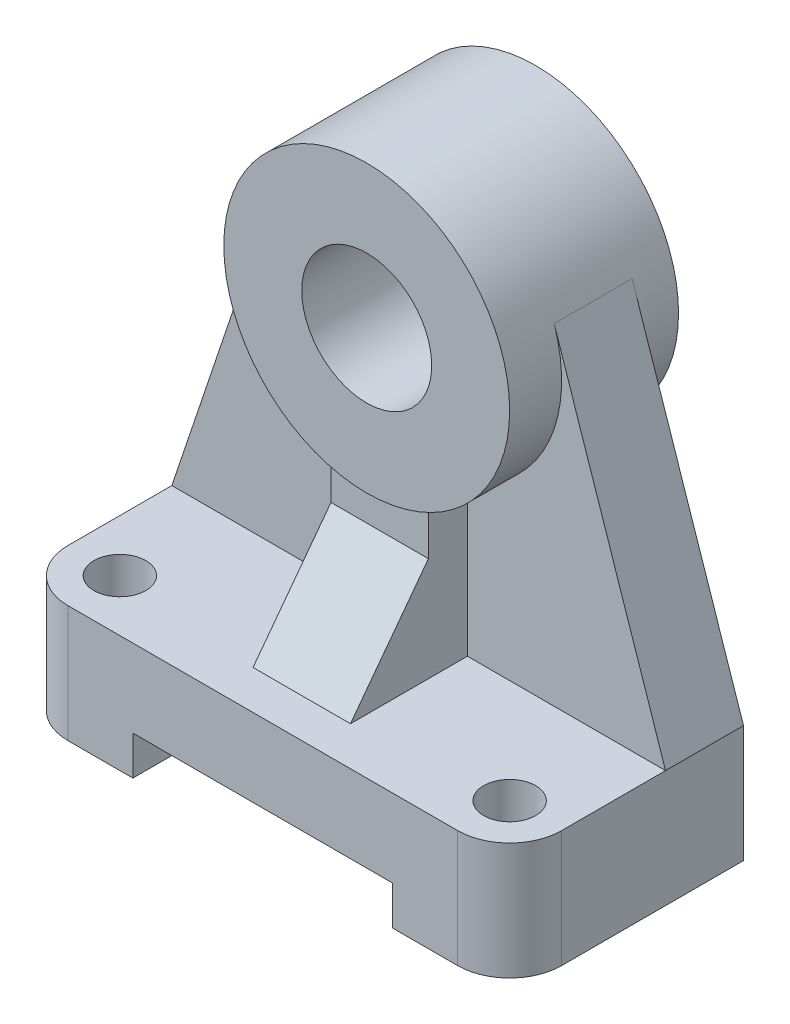
ISO-10303-21;
HEADER;
FILE_DESCRIPTION(('STEP AP214'),'2;1');
FILE_NAME('part.step','',(''),(''),'','','');
FILE_SCHEMA(('AUTOMOTIVE_DESIGN { 1 0 10303 214 1 1 1 1 }'));
ENDSEC;
DATA;
#1=APPLICATION_CONTEXT('core data for automotive mechanical design processes');
#2=APPLICATION_PROTOCOL_DEFINITION('international standard','automotive_design',2000,#1);
#3=PRODUCT_CONTEXT('',#1,'mechanical');
#4=PRODUCT('Part','Part','',(#3));
#5=PRODUCT_RELATED_PRODUCT_CATEGORY('part','',(#4));
#6=PRODUCT_DEFINITION_FORMATION('','',#4);
#7=PRODUCT_DEFINITION_CONTEXT('part definition',#1,'design');
#8=PRODUCT_DEFINITION('design','',#6,#7);
#9=PRODUCT_DEFINITION_SHAPE('','',#8);
#10=(LENGTH_UNIT() NAMED_UNIT(*) SI_UNIT(.MILLI.,.METRE.));
#11=(NAMED_UNIT(*) PLANE_ANGLE_UNIT() SI_UNIT($,.RADIAN.));
#12=(NAMED_UNIT(*) SI_UNIT($,.STERADIAN.) SOLID_ANGLE_UNIT());
#13=UNCERTAINTY_MEASURE_WITH_UNIT(LENGTH_MEASURE(1.E-05),#10,'distance_accuracy_value','');
#14=(GEOMETRIC_REPRESENTATION_CONTEXT(3) GLOBAL_UNCERTAINTY_ASSIGNED_CONTEXT((#13)) GLOBAL_UNIT_ASSIGNED_CONTEXT((#10,
#11,#12)) REPRESENTATION_CONTEXT('',''));
#15=CARTESIAN_POINT('',(0.,0.,0.));
#16=DIRECTION('',(0.,0.,1.));
#17=DIRECTION('',(1.,0.,0.));
#18=AXIS2_PLACEMENT_3D('',#15,#16,#17);
#19=CARTESIAN_POINT('',(22.75,24.,6.));
#20=DIRECTION('',(0.,0.,1.));
#21=DIRECTION('',(1.,0.,0.));
#22=AXIS2_PLACEMENT_3D('',#19,#20,#21);
#23=PLANE('',#22);
#24=DIRECTION('',(-1.,0.,0.));
#25=VECTOR('',#24,1.);
#26=CARTESIAN_POINT('',(22.75,20.,6.));
#27=LINE('',#26,#25);
#28=CARTESIAN_POINT('',(22.75,20.,6.));
#29=VERTEX_POINT('',#28);
#30=CARTESIAN_POINT('',(15.25,20.,6.));
#31=VERTEX_POINT('',#30);
#32=EDGE_CURVE('E121',#29,#31,#27,.T.);
#33=ORIENTED_EDGE('',*,*,#32,.T.);
#34=DIRECTION('',(0.,-1.,0.));
#35=VECTOR('',#34,1.);
#36=CARTESIAN_POINT('',(15.25,24.,6.));
#37=LINE('',#36,#35);
#38=CARTESIAN_POINT('',(15.25,24.,6.));
#39=VERTEX_POINT('',#38);
#40=EDGE_CURVE('E12',#39,#31,#37,.T.);
#41=ORIENTED_EDGE('',*,*,#40,.F.);
#42=DIRECTION('',(-1.,0.,0.));
#43=VECTOR('',#42,1.);
#44=CARTESIAN_POINT('',(22.75,24.,6.));
#45=LINE('',#44,#43);
#46=CARTESIAN_POINT('',(22.75,24.,6.));
#47=VERTEX_POINT('',#46);
#48=EDGE_CURVE('E109',#47,#39,#45,.T.);
#49=ORIENTED_EDGE('',*,*,#48,.F.);
#50=DIRECTION('',(0.,-1.,0.));
#51=VECTOR('',#50,1.);
#52=CARTESIAN_POINT('',(22.75,24.,6.));
#53=LINE('',#52,#51);
#54=EDGE_CURVE('E117',#47,#29,#53,.T.);
#55=ORIENTED_EDGE('',*,*,#54,.T.);
#56=EDGE_LOOP('',(#33,#41,#49,#55));
#57=FACE_BOUND('',#56,.T.);
#58=ADVANCED_FACE('F58',(#57),#23,.F.);
#59=CARTESIAN_POINT('',(15.25,24.,6.));
#60=DIRECTION('',(1.,0.,0.));
#61=DIRECTION('',(0.,0.,-1.));
#62=AXIS2_PLACEMENT_3D('',#59,#60,#61);
#63=PLANE('',#62);
#64=DIRECTION('',(0.,0.,1.));
#65=VECTOR('',#64,1.);
#66=CARTESIAN_POINT('',(15.25,20.,6.));
#67=LINE('',#66,#65);
#68=CARTESIAN_POINT('',(15.25,20.,9.));
#69=VERTEX_POINT('',#68);
#70=EDGE_CURVE('E113',#31,#69,#67,.T.);
#71=ORIENTED_EDGE('',*,*,#70,.T.);
#72=DIRECTION('',(0.,-1.,0.));
#73=VECTOR('',#72,1.);
#74=CARTESIAN_POINT('',(15.25,24.,9.));
#75=LINE('',#74,#73);
#76=CARTESIAN_POINT('',(15.25,24.,9.));
#77=VERTEX_POINT('',#76);
#78=EDGE_CURVE('E66',#77,#69,#75,.T.);
#79=ORIENTED_EDGE('',*,*,#78,.F.);
#80=DIRECTION('',(0.,0.,1.));
#81=VECTOR('',#80,1.);
#82=CARTESIAN_POINT('',(15.25,24.,6.));
#83=LINE('',#82,#81);
#84=EDGE_CURVE('E104',#39,#77,#83,.T.);
#85=ORIENTED_EDGE('',*,*,#84,.F.);
#86=ORIENTED_EDGE('',*,*,#40,.T.);
#87=EDGE_LOOP('',(#71,#79,#85,#86));
#88=FACE_BOUND('',#87,.T.);
#89=ADVANCED_FACE('F112',(#88),#63,.F.);
#90=CARTESIAN_POINT('',(15.25,24.,9.));
#91=DIRECTION('',(0.,0.,-1.));
#92=DIRECTION('',(-1.,0.,0.));
#93=AXIS2_PLACEMENT_3D('',#90,#91,#92);
#94=PLANE('',#93);
#95=DIRECTION('',(1.,0.,0.));
#96=VECTOR('',#95,1.);
#97=CARTESIAN_POINT('',(15.25,20.,9.));
#98=LINE('',#97,#96);
#99=CARTESIAN_POINT('',(22.75,20.,9.));
#100=VERTEX_POINT('',#99);
#101=EDGE_CURVE('E91',#69,#100,#98,.T.);
#102=ORIENTED_EDGE('',*,*,#101,.T.);
#103=DIRECTION('',(0.,-1.,0.));
#104=VECTOR('',#103,1.);
#105=CARTESIAN_POINT('',(22.75,24.,9.));
#106=LINE('',#105,#104);
#107=CARTESIAN_POINT('',(22.75,24.,9.));
#108=VERTEX_POINT('',#107);
#109=EDGE_CURVE('E114',#108,#100,#106,.T.);
#110=ORIENTED_EDGE('',*,*,#109,.F.);
#111=DIRECTION('',(1.,0.,0.));
#112=VECTOR('',#111,1.);
#113=CARTESIAN_POINT('',(15.25,24.,9.));
#114=LINE('',#113,#112);
#115=EDGE_CURVE('E107',#77,#108,#114,.T.);
#116=ORIENTED_EDGE('',*,*,#115,.F.);
#117=ORIENTED_EDGE('',*,*,#78,.T.);
#118=EDGE_LOOP('',(#102,#110,#116,#117));
#119=FACE_BOUND('',#118,.T.);
#120=ADVANCED_FACE('F115',(#119),#94,.F.);
#121=CARTESIAN_POINT('',(22.75,24.,9.));
#122=DIRECTION('',(-1.,0.,0.));
#123=DIRECTION('',(0.,0.,1.));
#124=AXIS2_PLACEMENT_3D('',#121,#122,#123);
#125=PLANE('',#124);
#126=DIRECTION('',(0.,0.,-1.));
#127=VECTOR('',#126,1.);
#128=CARTESIAN_POINT('',(22.75,20.,9.));
#129=LINE('',#128,#127);
#130=EDGE_CURVE('E97',#100,#29,#129,.T.);
#131=ORIENTED_EDGE('',*,*,#130,.T.);
#132=ORIENTED_EDGE('',*,*,#54,.F.);
#133=DIRECTION('',(0.,0.,-1.));
#134=VECTOR('',#133,1.);
#135=CARTESIAN_POINT('',(22.75,24.,9.));
#136=LINE('',#135,#134);
#137=EDGE_CURVE('E74',#108,#47,#136,.T.);
#138=ORIENTED_EDGE('',*,*,#137,.F.);
#139=ORIENTED_EDGE('',*,*,#109,.T.);
#140=EDGE_LOOP('',(#131,#132,#138,#139));
#141=FACE_BOUND('',#140,.T.);
#142=ADVANCED_FACE('F128',(#141),#125,.F.);
#143=CARTESIAN_POINT('',(0.,24.,0.));
#144=DIRECTION('',(0.,1.,0.));
#145=DIRECTION('',(0.,0.,1.));
#146=AXIS2_PLACEMENT_3D('',#143,#144,#145);
#147=PLANE('',#146);
#148=ORIENTED_EDGE('',*,*,#48,.T.);
#149=ORIENTED_EDGE('',*,*,#84,.T.);
#150=ORIENTED_EDGE('',*,*,#115,.T.);
#151=ORIENTED_EDGE('',*,*,#137,.T.);
#152=EDGE_LOOP('',(#148,#149,#150,#151));
#153=FACE_BOUND('',#152,.T.);
#154=ADVANCED_FACE('F105',(#153),#147,.T.);
#155=CARTESIAN_POINT('',(0.,20.,0.));
#156=DIRECTION('',(0.,1.,0.));
#157=DIRECTION('',(0.,0.,1.));
#158=AXIS2_PLACEMENT_3D('',#155,#156,#157);
#159=PLANE('',#158);
#160=ORIENTED_EDGE('',*,*,#32,.F.);
#161=ORIENTED_EDGE('',*,*,#130,.F.);
#162=ORIENTED_EDGE('',*,*,#101,.F.);
#163=ORIENTED_EDGE('',*,*,#70,.F.);
#164=EDGE_LOOP('',(#160,#161,#162,#163));
#165=FACE_BOUND('',#164,.T.);
#166=ADVANCED_FACE('F131',(#165),#159,.F.);
#167=CLOSED_SHELL('',(#58,#89,#120,#142,#154,#166));
#168=MANIFOLD_SOLID_BREP('B2',#167);
#169=CARTESIAN_POINT('',(22.75,0.,9.));
#170=DIRECTION('',(0.,0.,1.));
#171=DIRECTION('',(1.,0.,0.));
#172=AXIS2_PLACEMENT_3D('',#169,#170,#171);
#173=PLANE('',#172);
#174=DIRECTION('',(0.,1.,0.));
#175=VECTOR('',#174,1.);
#176=CARTESIAN_POINT('',(15.25,0.,9.));
#177=LINE('',#176,#175);
#178=CARTESIAN_POINT('',(15.25,17.,9.00000000000001));
#179=VERTEX_POINT('',#178);
#180=CARTESIAN_POINT('',(15.25,20.,9.));
#181=VERTEX_POINT('',#180);
#182=EDGE_CURVE('E263',#179,#181,#177,.T.);
#183=ORIENTED_EDGE('',*,*,#182,.F.);
#184=DIRECTION('',(-1.,0.,0.));
#185=VECTOR('',#184,1.);
#186=CARTESIAN_POINT('',(22.75,17.,9.00000000000001));
#187=LINE('',#186,#185);
#188=CARTESIAN_POINT('',(22.75,17.,9.00000000000001));
#189=VERTEX_POINT('',#188);
#190=EDGE_CURVE('E56',#189,#179,#187,.T.);
#191=ORIENTED_EDGE('',*,*,#190,.F.);
#192=DIRECTION('',(0.,1.,0.));
#193=VECTOR('',#192,1.);
#194=CARTESIAN_POINT('',(22.75,0.,9.));
#195=LINE('',#194,#193);
#196=CARTESIAN_POINT('',(22.75,20.,9.));
#197=VERTEX_POINT('',#196);
#198=EDGE_CURVE('E274',#189,#197,#195,.T.);
#199=ORIENTED_EDGE('',*,*,#198,.T.);
#200=DIRECTION('',(-1.,0.,0.));
#201=VECTOR('',#200,1.);
#202=CARTESIAN_POINT('',(22.75,20.,9.));
#203=LINE('',#202,#201);
#204=EDGE_CURVE('E206',#197,#181,#203,.T.);
#205=ORIENTED_EDGE('',*,*,#204,.T.);
#206=EDGE_LOOP('',(#183,#191,#199,#205));
#207=FACE_BOUND('',#206,.T.);
#208=ADVANCED_FACE('F190',(#207),#173,.T.);
#209=CARTESIAN_POINT('',(22.75,10.44,13.92));
#210=DIRECTION('',(0.,0.6,0.8));
#211=DIRECTION('',(0.,-0.8,0.6));
#212=AXIS2_PLACEMENT_3D('',#209,#210,#211);
#213=PLANE('',#212);
#214=DIRECTION('',(0.,0.8,-0.6));
#215=VECTOR('',#214,1.);
#216=CARTESIAN_POINT('',(15.25,10.44,13.92));
#217=LINE('',#216,#215);
#218=CARTESIAN_POINT('',(15.25,9.,15.));
#219=VERTEX_POINT('',#218);
#220=EDGE_CURVE('E265',#219,#179,#217,.T.);
#221=ORIENTED_EDGE('',*,*,#220,.F.);
#222=DIRECTION('',(-1.,0.,0.));
#223=VECTOR('',#222,1.);
#224=CARTESIAN_POINT('',(22.75,9.,15.));
#225=LINE('',#224,#223);
#226=CARTESIAN_POINT('',(22.75,9.,15.));
#227=VERTEX_POINT('',#226);
#228=EDGE_CURVE('E198',#227,#219,#225,.T.);
#229=ORIENTED_EDGE('',*,*,#228,.F.);
#230=DIRECTION('',(0.,0.8,-0.6));
#231=VECTOR('',#230,1.);
#232=CARTESIAN_POINT('',(22.75,10.44,13.92));
#233=LINE('',#232,#231);
#234=EDGE_CURVE('E255',#227,#189,#233,.T.);
#235=ORIENTED_EDGE('',*,*,#234,.T.);
#236=ORIENTED_EDGE('',*,*,#190,.T.);
#237=EDGE_LOOP('',(#221,#229,#235,#236));
#238=FACE_BOUND('',#237,.T.);
#239=ADVANCED_FACE('F278',(#238),#213,.T.);
#240=CARTESIAN_POINT('',(22.75,9.,0.));
#241=DIRECTION('',(0.,-1.,0.));
#242=DIRECTION('',(0.,0.,-1.));
#243=AXIS2_PLACEMENT_3D('',#240,#241,#242);
#244=PLANE('',#243);
#245=DIRECTION('',(0.,0.,1.));
#246=VECTOR('',#245,1.);
#247=CARTESIAN_POINT('',(15.25,9.,0.));
#248=LINE('',#247,#246);
#249=CARTESIAN_POINT('',(15.25,9.,6.));
#250=VERTEX_POINT('',#249);
#251=EDGE_CURVE('E243',#250,#219,#248,.T.);
#252=ORIENTED_EDGE('',*,*,#251,.F.);
#253=DIRECTION('',(-1.,0.,0.));
#254=VECTOR('',#253,1.);
#255=CARTESIAN_POINT('',(22.75,9.,6.));
#256=LINE('',#255,#254);
#257=CARTESIAN_POINT('',(22.75,9.,6.));
#258=VERTEX_POINT('',#257);
#259=EDGE_CURVE('E238',#258,#250,#256,.T.);
#260=ORIENTED_EDGE('',*,*,#259,.F.);
#261=DIRECTION('',(0.,0.,1.));
#262=VECTOR('',#261,1.);
#263=CARTESIAN_POINT('',(22.75,9.,0.));
#264=LINE('',#263,#262);
#265=EDGE_CURVE('E241',#258,#227,#264,.T.);
#266=ORIENTED_EDGE('',*,*,#265,.T.);
#267=ORIENTED_EDGE('',*,*,#228,.T.);
#268=EDGE_LOOP('',(#252,#260,#266,#267));
#269=FACE_BOUND('',#268,.T.);
#270=ADVANCED_FACE('F240',(#269),#244,.T.);
#271=CARTESIAN_POINT('',(22.75,0.,6.));
#272=DIRECTION('',(0.,0.,-1.));
#273=DIRECTION('',(0.,1.,0.));
#274=AXIS2_PLACEMENT_3D('',#271,#272,#273);
#275=PLANE('',#274);
#276=DIRECTION('',(0.,-1.,0.));
#277=VECTOR('',#276,1.);
#278=CARTESIAN_POINT('',(15.25,0.,6.));
#279=LINE('',#278,#277);
#280=CARTESIAN_POINT('',(15.25,20.,6.));
#281=VERTEX_POINT('',#280);
#282=EDGE_CURVE('E269',#281,#250,#279,.T.);
#283=ORIENTED_EDGE('',*,*,#282,.F.);
#284=DIRECTION('',(-1.,0.,0.));
#285=VECTOR('',#284,1.);
#286=CARTESIAN_POINT('',(22.75,20.,6.));
#287=LINE('',#286,#285);
#288=CARTESIAN_POINT('',(22.75,20.,6.));
#289=VERTEX_POINT('',#288);
#290=EDGE_CURVE('E222',#289,#281,#287,.T.);
#291=ORIENTED_EDGE('',*,*,#290,.F.);
#292=DIRECTION('',(0.,-1.,0.));
#293=VECTOR('',#292,1.);
#294=CARTESIAN_POINT('',(22.75,0.,6.));
#295=LINE('',#294,#293);
#296=EDGE_CURVE('E253',#289,#258,#295,.T.);
#297=ORIENTED_EDGE('',*,*,#296,.T.);
#298=ORIENTED_EDGE('',*,*,#259,.T.);
#299=EDGE_LOOP('',(#283,#291,#297,#298));
#300=FACE_BOUND('',#299,.T.);
#301=ADVANCED_FACE('F257',(#300),#275,.T.);
#302=CARTESIAN_POINT('',(22.75,20.,0.));
#303=DIRECTION('',(0.,1.,0.));
#304=DIRECTION('',(0.,0.,1.));
#305=AXIS2_PLACEMENT_3D('',#302,#303,#304);
#306=PLANE('',#305);
#307=DIRECTION('',(0.,0.,-1.));
#308=VECTOR('',#307,1.);
#309=CARTESIAN_POINT('',(15.25,20.,0.));
#310=LINE('',#309,#308);
#311=EDGE_CURVE('E271',#181,#281,#310,.T.);
#312=ORIENTED_EDGE('',*,*,#311,.F.);
#313=ORIENTED_EDGE('',*,*,#204,.F.);
#314=DIRECTION('',(0.,0.,-1.));
#315=VECTOR('',#314,1.);
#316=CARTESIAN_POINT('',(22.75,20.,0.));
#317=LINE('',#316,#315);
#318=EDGE_CURVE('E258',#197,#289,#317,.T.);
#319=ORIENTED_EDGE('',*,*,#318,.T.);
#320=ORIENTED_EDGE('',*,*,#290,.T.);
#321=EDGE_LOOP('',(#312,#313,#319,#320));
#322=FACE_BOUND('',#321,.T.);
#323=ADVANCED_FACE('F281',(#322),#306,.T.);
#324=CARTESIAN_POINT('',(22.75,0.,0.));
#325=DIRECTION('',(1.,0.,0.));
#326=DIRECTION('',(0.,0.,-1.));
#327=AXIS2_PLACEMENT_3D('',#324,#325,#326);
#328=PLANE('',#327);
#329=ORIENTED_EDGE('',*,*,#198,.F.);
#330=ORIENTED_EDGE('',*,*,#234,.F.);
#331=ORIENTED_EDGE('',*,*,#265,.F.);
#332=ORIENTED_EDGE('',*,*,#296,.F.);
#333=ORIENTED_EDGE('',*,*,#318,.F.);
#334=EDGE_LOOP('',(#329,#330,#331,#332,#333));
#335=FACE_BOUND('',#334,.T.);
#336=ADVANCED_FACE('F251',(#335),#328,.T.);
#337=CARTESIAN_POINT('',(15.25,0.,0.));
#338=DIRECTION('',(1.,0.,0.));
#339=DIRECTION('',(0.,0.,-1.));
#340=AXIS2_PLACEMENT_3D('',#337,#338,#339);
#341=PLANE('',#340);
#342=ORIENTED_EDGE('',*,*,#182,.T.);
#343=ORIENTED_EDGE('',*,*,#311,.T.);
#344=ORIENTED_EDGE('',*,*,#282,.T.);
#345=ORIENTED_EDGE('',*,*,#251,.T.);
#346=ORIENTED_EDGE('',*,*,#220,.T.);
#347=EDGE_LOOP('',(#342,#343,#344,#345,#346));
#348=FACE_BOUND('',#347,.T.);
#349=ADVANCED_FACE('F280',(#348),#341,.F.);
#350=CLOSED_SHELL('',(#208,#239,#270,#301,#323,#336,#349));
#351=MANIFOLD_SOLID_BREP('B6',#350);
#352=CARTESIAN_POINT('',(4.,0.,14.));
#353=DIRECTION('',(0.,1.,0.));
#354=DIRECTION('',(0.,0.,1.));
#355=AXIS2_PLACEMENT_3D('',#352,#353,#354);
#356=PLANE('',#355);
#357=CARTESIAN_POINT('',(34.,0.,14.));
#358=DIRECTION('',(0.,1.,0.));
#359=DIRECTION('',(0.,0.,1.));
#360=AXIS2_PLACEMENT_3D('',#357,#358,#359);
#361=CIRCLE('',#360,2.);
#362=CARTESIAN_POINT('',(34.,0.,16.));
#363=VERTEX_POINT('',#362);
#364=EDGE_CURVE('E574',#363,#363,#361,.T.);
#365=ORIENTED_EDGE('',*,*,#364,.T.);
#366=EDGE_LOOP('',(#365));
#367=FACE_BOUND('',#366,.T.);
#368=DIRECTION('',(0.,0.,-1.));
#369=VECTOR('',#368,1.);
#370=CARTESIAN_POINT('',(29.,0.,18.001));
#371=LINE('',#370,#369);
#372=CARTESIAN_POINT('',(29.,0.,18.));
#373=VERTEX_POINT('',#372);
#374=CARTESIAN_POINT('',(29.,0.,0.));
#375=VERTEX_POINT('',#374);
#376=EDGE_CURVE('E442',#373,#375,#371,.T.);
#377=ORIENTED_EDGE('',*,*,#376,.T.);
#378=DIRECTION('',(-1.,0.,0.));
#379=VECTOR('',#378,1.);
#380=CARTESIAN_POINT('',(0.,0.,0.));
#381=LINE('',#380,#379);
#382=CARTESIAN_POINT('',(38.,0.,0.));
#383=VERTEX_POINT('',#382);
#384=EDGE_CURVE('E486',#383,#375,#381,.T.);
#385=ORIENTED_EDGE('',*,*,#384,.F.);
#386=DIRECTION('',(0.,0.,-1.));
#387=VECTOR('',#386,1.);
#388=CARTESIAN_POINT('',(38.,0.,0.));
#389=LINE('',#388,#387);
#390=CARTESIAN_POINT('',(38.,0.,14.));
#391=VERTEX_POINT('',#390);
#392=EDGE_CURVE('E482',#391,#383,#389,.T.);
#393=ORIENTED_EDGE('',*,*,#392,.F.);
#394=CARTESIAN_POINT('',(34.,0.,14.));
#395=DIRECTION('',(0.,1.,0.));
#396=DIRECTION('',(0.,0.,1.));
#397=AXIS2_PLACEMENT_3D('',#394,#395,#396);
#398=CIRCLE('',#397,4.);
#399=CARTESIAN_POINT('',(34.,0.,18.));
#400=VERTEX_POINT('',#399);
#401=EDGE_CURVE('E468',#400,#391,#398,.T.);
#402=ORIENTED_EDGE('',*,*,#401,.F.);
#403=DIRECTION('',(1.,0.,0.));
#404=VECTOR('',#403,1.);
#405=CARTESIAN_POINT('',(4.00000000000003,0.,18.));
#406=LINE('',#405,#404);
#407=EDGE_CURVE('E459',#373,#400,#406,.T.);
#408=ORIENTED_EDGE('',*,*,#407,.F.);
#409=EDGE_LOOP('',(#377,#385,#393,#402,#408));
#410=FACE_BOUND('',#409,.T.);
#411=ADVANCED_FACE('F345',(#367,#410),#356,.F.);
#412=CARTESIAN_POINT('',(4.00000000000003,9.,18.));
#413=DIRECTION('',(0.,0.,-1.));
#414=DIRECTION('',(-1.,0.,0.));
#415=AXIS2_PLACEMENT_3D('',#412,#413,#414);
#416=PLANE('',#415);
#417=DIRECTION('',(0.,-1.,0.));
#418=VECTOR('',#417,1.);
#419=CARTESIAN_POINT('',(29.,0.,18.));
#420=LINE('',#419,#418);
#421=CARTESIAN_POINT('',(29.,3.,18.));
#422=VERTEX_POINT('',#421);
#423=EDGE_CURVE('E445',#422,#373,#420,.T.);
#424=ORIENTED_EDGE('',*,*,#423,.T.);
#425=ORIENTED_EDGE('',*,*,#407,.T.);
#426=DIRECTION('',(0.,-1.,0.));
#427=VECTOR('',#426,1.);
#428=CARTESIAN_POINT('',(34.,9.,18.));
#429=LINE('',#428,#427);
#430=CARTESIAN_POINT('',(34.,9.,18.));
#431=VERTEX_POINT('',#430);
#432=EDGE_CURVE('E503',#431,#400,#429,.T.);
#433=ORIENTED_EDGE('',*,*,#432,.F.);
#434=DIRECTION('',(1.,0.,0.));
#435=VECTOR('',#434,1.);
#436=CARTESIAN_POINT('',(4.00000000000003,9.,18.));
#437=LINE('',#436,#435);
#438=CARTESIAN_POINT('',(4.00000000000003,9.,18.));
#439=VERTEX_POINT('',#438);
#440=EDGE_CURVE('E510',#439,#431,#437,.T.);
#441=ORIENTED_EDGE('',*,*,#440,.F.);
#442=DIRECTION('',(0.,-1.,0.));
#443=VECTOR('',#442,1.);
#444=CARTESIAN_POINT('',(4.00000000000003,9.,18.));
#445=LINE('',#444,#443);
#446=CARTESIAN_POINT('',(4.00000000000003,0.,18.));
#447=VERTEX_POINT('',#446);
#448=EDGE_CURVE('E354',#439,#447,#445,.T.);
#449=ORIENTED_EDGE('',*,*,#448,.T.);
#450=CARTESIAN_POINT('',(9.,0.,18.));
#451=VERTEX_POINT('',#450);
#452=EDGE_CURVE('E470',#447,#451,#406,.T.);
#453=ORIENTED_EDGE('',*,*,#452,.T.);
#454=DIRECTION('',(0.,-1.,0.));
#455=VECTOR('',#454,1.);
#456=CARTESIAN_POINT('',(9.,0.,18.));
#457=LINE('',#456,#455);
#458=CARTESIAN_POINT('',(9.,3.,18.));
#459=VERTEX_POINT('',#458);
#460=EDGE_CURVE('E696',#459,#451,#457,.T.);
#461=ORIENTED_EDGE('',*,*,#460,.F.);
#462=DIRECTION('',(-1.,0.,0.));
#463=VECTOR('',#462,1.);
#464=CARTESIAN_POINT('',(9.,3.,18.));
#465=LINE('',#464,#463);
#466=EDGE_CURVE('E463',#422,#459,#465,.T.);
#467=ORIENTED_EDGE('',*,*,#466,.F.);
#468=EDGE_LOOP('',(#424,#425,#433,#441,#449,#453,#461,#467));
#469=FACE_BOUND('',#468,.T.);
#470=ADVANCED_FACE('F457',(#469),#416,.F.);
#471=CARTESIAN_POINT('',(0.,9.,0.));
#472=DIRECTION('',(0.,0.,1.));
#473=DIRECTION('',(1.,0.,0.));
#474=AXIS2_PLACEMENT_3D('',#471,#472,#473);
#475=PLANE('',#474);
#476=DIRECTION('',(0.,1.,0.));
#477=VECTOR('',#476,1.);
#478=CARTESIAN_POINT('',(29.,0.,0.));
#479=LINE('',#478,#477);
#480=CARTESIAN_POINT('',(29.,3.,0.));
#481=VERTEX_POINT('',#480);
#482=EDGE_CURVE('E448',#375,#481,#479,.T.);
#483=ORIENTED_EDGE('',*,*,#482,.T.);
#484=DIRECTION('',(1.,0.,0.));
#485=VECTOR('',#484,1.);
#486=CARTESIAN_POINT('',(9.,3.,0.));
#487=LINE('',#486,#485);
#488=CARTESIAN_POINT('',(9.,3.,0.));
#489=VERTEX_POINT('',#488);
#490=EDGE_CURVE('E704',#489,#481,#487,.T.);
#491=ORIENTED_EDGE('',*,*,#490,.F.);
#492=DIRECTION('',(0.,1.,0.));
#493=VECTOR('',#492,1.);
#494=CARTESIAN_POINT('',(9.,0.,0.));
#495=LINE('',#494,#493);
#496=CARTESIAN_POINT('',(9.,0.,0.));
#497=VERTEX_POINT('',#496);
#498=EDGE_CURVE('E454',#497,#489,#495,.T.);
#499=ORIENTED_EDGE('',*,*,#498,.F.);
#500=CARTESIAN_POINT('',(0.,0.,0.));
#501=VERTEX_POINT('',#500);
#502=EDGE_CURVE('E485',#497,#501,#381,.T.);
#503=ORIENTED_EDGE('',*,*,#502,.T.);
#504=DIRECTION('',(0.,-1.,0.));
#505=VECTOR('',#504,1.);
#506=CARTESIAN_POINT('',(0.,9.,0.));
#507=LINE('',#506,#505);
#508=CARTESIAN_POINT('',(0.,9.,0.));
#509=VERTEX_POINT('',#508);
#510=EDGE_CURVE('E490',#509,#501,#507,.T.);
#511=ORIENTED_EDGE('',*,*,#510,.F.);
#512=DIRECTION('',(0.318624513359528,0.947881015468927,0.));
#513=VECTOR('',#512,1.);
#514=CARTESIAN_POINT('',(-2.7181631454887,0.913694224622362,0.));
#515=LINE('',#514,#513);
#516=CARTESIAN_POINT('',(8.5733088298418,34.5048696469548,0.));
#517=VERTEX_POINT('',#516);
#518=EDGE_CURVE('E544',#509,#517,#515,.T.);
#519=ORIENTED_EDGE('',*,*,#518,.T.);
#520=CARTESIAN_POINT('',(19.,31.,0.));
#521=DIRECTION('',(0.,0.,-1.));
#522=DIRECTION('',(-1.,0.,0.));
#523=AXIS2_PLACEMENT_3D('',#520,#521,#522);
#524=CIRCLE('',#523,11.);
#525=CARTESIAN_POINT('',(29.4266911701582,34.5048696469548,0.));
#526=VERTEX_POINT('',#525);
#527=EDGE_CURVE('E564',#526,#517,#524,.T.);
#528=ORIENTED_EDGE('',*,*,#527,.F.);
#529=DIRECTION('',(-0.318624513359528,0.947881015468927,0.));
#530=VECTOR('',#529,1.);
#531=CARTESIAN_POINT('',(36.8603430859721,12.3903830611302,0.));
#532=LINE('',#531,#530);
#533=CARTESIAN_POINT('',(38.,9.,0.));
#534=VERTEX_POINT('',#533);
#535=EDGE_CURVE('E548',#534,#526,#532,.T.);
#536=ORIENTED_EDGE('',*,*,#535,.F.);
#537=DIRECTION('',(0.,-1.,0.));
#538=VECTOR('',#537,1.);
#539=CARTESIAN_POINT('',(38.,9.,0.));
#540=LINE('',#539,#538);
#541=EDGE_CURVE('E494',#534,#383,#540,.T.);
#542=ORIENTED_EDGE('',*,*,#541,.T.);
#543=ORIENTED_EDGE('',*,*,#384,.T.);
#544=EDGE_LOOP('',(#483,#491,#499,#503,#511,#519,#528,#536,#542,#543));
#545=FACE_BOUND('',#544,.T.);
#546=ADVANCED_FACE('F616',(#545),#475,.F.);
#547=CARTESIAN_POINT('',(4.,9.,14.));
#548=DIRECTION('',(0.,1.,0.));
#549=DIRECTION('',(0.,0.,1.));
#550=AXIS2_PLACEMENT_3D('',#547,#548,#549);
#551=PLANE('',#550);
#552=DIRECTION('',(1.,0.,0.));
#553=VECTOR('',#552,1.);
#554=CARTESIAN_POINT('',(0.,9.,6.));
#555=LINE('',#554,#553);
#556=CARTESIAN_POINT('',(0.,9.,6.));
#557=VERTEX_POINT('',#556);
#558=CARTESIAN_POINT('',(38.,9.,6.));
#559=VERTEX_POINT('',#558);
#560=EDGE_CURVE('E369',#557,#559,#555,.T.);
#561=ORIENTED_EDGE('',*,*,#560,.F.);
#562=DIRECTION('',(0.,0.,1.));
#563=VECTOR('',#562,1.);
#564=CARTESIAN_POINT('',(0.,9.,0.));
#565=LINE('',#564,#563);
#566=CARTESIAN_POINT('',(0.,9.,14.));
#567=VERTEX_POINT('',#566);
#568=EDGE_CURVE('E489',#557,#567,#565,.T.);
#569=ORIENTED_EDGE('',*,*,#568,.T.);
#570=CARTESIAN_POINT('',(4.,9.,14.));
#571=DIRECTION('',(0.,1.,0.));
#572=DIRECTION('',(0.,0.,1.));
#573=AXIS2_PLACEMENT_3D('',#570,#571,#572);
#574=CIRCLE('',#573,4.);
#575=EDGE_CURVE('E600',#567,#439,#574,.T.);
#576=ORIENTED_EDGE('',*,*,#575,.T.);
#577=ORIENTED_EDGE('',*,*,#440,.T.);
#578=CARTESIAN_POINT('',(34.,9.,14.));
#579=DIRECTION('',(0.,1.,0.));
#580=DIRECTION('',(0.,0.,1.));
#581=AXIS2_PLACEMENT_3D('',#578,#579,#580);
#582=CIRCLE('',#581,4.);
#583=CARTESIAN_POINT('',(38.,9.,14.));
#584=VERTEX_POINT('',#583);
#585=EDGE_CURVE('E605',#431,#584,#582,.T.);
#586=ORIENTED_EDGE('',*,*,#585,.T.);
#587=DIRECTION('',(0.,0.,-1.));
#588=VECTOR('',#587,1.);
#589=CARTESIAN_POINT('',(38.,9.,0.));
#590=LINE('',#589,#588);
#591=EDGE_CURVE('E495',#584,#559,#590,.T.);
#592=ORIENTED_EDGE('',*,*,#591,.T.);
#593=EDGE_LOOP('',(#561,#569,#576,#577,#586,#592));
#594=FACE_BOUND('',#593,.T.);
#595=CARTESIAN_POINT('',(4.,9.,14.));
#596=DIRECTION('',(0.,1.,0.));
#597=DIRECTION('',(0.,0.,1.));
#598=AXIS2_PLACEMENT_3D('',#595,#596,#597);
#599=CIRCLE('',#598,2.);
#600=CARTESIAN_POINT('',(4.,9.,16.));
#601=VERTEX_POINT('',#600);
#602=EDGE_CURVE('E589',#601,#601,#599,.T.);
#603=ORIENTED_EDGE('',*,*,#602,.F.);
#604=EDGE_LOOP('',(#603));
#605=FACE_BOUND('',#604,.T.);
#606=CARTESIAN_POINT('',(34.,9.,14.));
#607=DIRECTION('',(0.,1.,0.));
#608=DIRECTION('',(0.,0.,1.));
#609=AXIS2_PLACEMENT_3D('',#606,#607,#608);
#610=CIRCLE('',#609,2.);
#611=CARTESIAN_POINT('',(34.,9.,16.));
#612=VERTEX_POINT('',#611);
#613=EDGE_CURVE('E581',#612,#612,#610,.T.);
#614=ORIENTED_EDGE('',*,*,#613,.F.);
#615=EDGE_LOOP('',(#614));
#616=FACE_BOUND('',#615,.T.);
#617=ADVANCED_FACE('F621',(#594,#605,#616),#551,.T.);
#618=ORIENTED_EDGE('',*,*,#502,.F.);
#619=DIRECTION('',(0.,0.,-1.));
#620=VECTOR('',#619,1.);
#621=CARTESIAN_POINT('',(9.,0.,18.001));
#622=LINE('',#621,#620);
#623=EDGE_CURVE('E361',#451,#497,#622,.T.);
#624=ORIENTED_EDGE('',*,*,#623,.F.);
#625=ORIENTED_EDGE('',*,*,#452,.F.);
#626=CARTESIAN_POINT('',(4.,0.,14.));
#627=DIRECTION('',(0.,1.,0.));
#628=DIRECTION('',(0.,0.,1.));
#629=AXIS2_PLACEMENT_3D('',#626,#627,#628);
#630=CIRCLE('',#629,4.);
#631=CARTESIAN_POINT('',(0.,0.,14.));
#632=VERTEX_POINT('',#631);
#633=EDGE_CURVE('E471',#632,#447,#630,.T.);
#634=ORIENTED_EDGE('',*,*,#633,.F.);
#635=DIRECTION('',(0.,0.,1.));
#636=VECTOR('',#635,1.);
#637=CARTESIAN_POINT('',(0.,0.,0.));
#638=LINE('',#637,#636);
#639=EDGE_CURVE('E476',#501,#632,#638,.T.);
#640=ORIENTED_EDGE('',*,*,#639,.F.);
#641=EDGE_LOOP('',(#618,#624,#625,#634,#640));
#642=FACE_BOUND('',#641,.T.);
#643=CARTESIAN_POINT('',(4.,0.,14.));
#644=DIRECTION('',(0.,1.,0.));
#645=DIRECTION('',(0.,0.,1.));
#646=AXIS2_PLACEMENT_3D('',#643,#644,#645);
#647=CIRCLE('',#646,2.);
#648=CARTESIAN_POINT('',(4.,0.,16.));
#649=VERTEX_POINT('',#648);
#650=EDGE_CURVE('E585',#649,#649,#647,.T.);
#651=ORIENTED_EDGE('',*,*,#650,.T.);
#652=EDGE_LOOP('',(#651));
#653=FACE_BOUND('',#652,.T.);
#654=ADVANCED_FACE('F515',(#642,#653),#356,.F.);
#655=CARTESIAN_POINT('',(0.,9.,0.));
#656=DIRECTION('',(1.,0.,0.));
#657=DIRECTION('',(0.,0.,-1.));
#658=AXIS2_PLACEMENT_3D('',#655,#656,#657);
#659=PLANE('',#658);
#660=ORIENTED_EDGE('',*,*,#639,.T.);
#661=DIRECTION('',(0.,-1.,0.));
#662=VECTOR('',#661,1.);
#663=CARTESIAN_POINT('',(0.,9.,14.));
#664=LINE('',#663,#662);
#665=EDGE_CURVE('E188',#567,#632,#664,.T.);
#666=ORIENTED_EDGE('',*,*,#665,.F.);
#667=ORIENTED_EDGE('',*,*,#568,.F.);
#668=EDGE_CURVE('E596',#509,#557,#565,.T.);
#669=ORIENTED_EDGE('',*,*,#668,.F.);
#670=ORIENTED_EDGE('',*,*,#510,.T.);
#671=EDGE_LOOP('',(#660,#666,#667,#669,#670));
#672=FACE_BOUND('',#671,.T.);
#673=ADVANCED_FACE('F347',(#672),#659,.F.);
#674=CARTESIAN_POINT('',(4.,9.,14.));
#675=DIRECTION('',(0.,-1.,0.));
#676=DIRECTION('',(0.,0.,-1.));
#677=AXIS2_PLACEMENT_3D('',#674,#675,#676);
#678=CYLINDRICAL_SURFACE('',#677,4.);
#679=ORIENTED_EDGE('',*,*,#633,.T.);
#680=ORIENTED_EDGE('',*,*,#448,.F.);
#681=ORIENTED_EDGE('',*,*,#575,.F.);
#682=ORIENTED_EDGE('',*,*,#665,.T.);
#683=EDGE_LOOP('',(#679,#680,#681,#682));
#684=FACE_BOUND('',#683,.T.);
#685=ADVANCED_FACE('F623',(#684),#678,.T.);
#686=CARTESIAN_POINT('',(34.,9.,14.));
#687=DIRECTION('',(0.,-1.,0.));
#688=DIRECTION('',(0.,0.,-1.));
#689=AXIS2_PLACEMENT_3D('',#686,#687,#688);
#690=CYLINDRICAL_SURFACE('',#689,4.);
#691=ORIENTED_EDGE('',*,*,#401,.T.);
#692=DIRECTION('',(0.,-1.,0.));
#693=VECTOR('',#692,1.);
#694=CARTESIAN_POINT('',(38.,9.,14.));
#695=LINE('',#694,#693);
#696=EDGE_CURVE('E499',#584,#391,#695,.T.);
#697=ORIENTED_EDGE('',*,*,#696,.F.);
#698=ORIENTED_EDGE('',*,*,#585,.F.);
#699=ORIENTED_EDGE('',*,*,#432,.T.);
#700=EDGE_LOOP('',(#691,#697,#698,#699));
#701=FACE_BOUND('',#700,.T.);
#702=ADVANCED_FACE('F625',(#701),#690,.T.);
#703=CARTESIAN_POINT('',(38.,9.,0.));
#704=DIRECTION('',(-1.,0.,0.));
#705=DIRECTION('',(0.,0.,1.));
#706=AXIS2_PLACEMENT_3D('',#703,#704,#705);
#707=PLANE('',#706);
#708=ORIENTED_EDGE('',*,*,#392,.T.);
#709=ORIENTED_EDGE('',*,*,#541,.F.);
#710=DIRECTION('',(0.,0.,-1.));
#711=VECTOR('',#710,1.);
#712=CARTESIAN_POINT('',(38.,9.,6.));
#713=LINE('',#712,#711);
#714=EDGE_CURVE('E570',#559,#534,#713,.T.);
#715=ORIENTED_EDGE('',*,*,#714,.F.);
#716=ORIENTED_EDGE('',*,*,#591,.F.);
#717=ORIENTED_EDGE('',*,*,#696,.T.);
#718=EDGE_LOOP('',(#708,#709,#715,#716,#717));
#719=FACE_BOUND('',#718,.T.);
#720=ADVANCED_FACE('F629',(#719),#707,.F.);
#721=CARTESIAN_POINT('',(4.,9.,14.));
#722=DIRECTION('',(0.,-1.,0.));
#723=DIRECTION('',(0.,0.,-1.));
#724=AXIS2_PLACEMENT_3D('',#721,#722,#723);
#725=CYLINDRICAL_SURFACE('',#724,2.);
#726=ORIENTED_EDGE('',*,*,#602,.T.);
#727=EDGE_LOOP('',(#726));
#728=FACE_BOUND('',#727,.T.);
#729=ORIENTED_EDGE('',*,*,#650,.F.);
#730=EDGE_LOOP('',(#729));
#731=FACE_BOUND('',#730,.T.);
#732=ADVANCED_FACE('F653',(#728,#731),#725,.F.);
#733=CARTESIAN_POINT('',(34.,9.,14.));
#734=DIRECTION('',(0.,-1.,0.));
#735=DIRECTION('',(0.,0.,-1.));
#736=AXIS2_PLACEMENT_3D('',#733,#734,#735);
#737=CYLINDRICAL_SURFACE('',#736,2.);
#738=ORIENTED_EDGE('',*,*,#613,.T.);
#739=EDGE_LOOP('',(#738));
#740=FACE_BOUND('',#739,.T.);
#741=ORIENTED_EDGE('',*,*,#364,.F.);
#742=EDGE_LOOP('',(#741));
#743=FACE_BOUND('',#742,.T.);
#744=ADVANCED_FACE('F656',(#740,#743),#737,.F.);
#745=CARTESIAN_POINT('',(36.8603430859721,12.3903830611302,6.));
#746=DIRECTION('',(-0.947881015468927,-0.318624513359528,0.));
#747=DIRECTION('',(0.318624513359528,-0.947881015468927,0.));
#748=AXIS2_PLACEMENT_3D('',#745,#746,#747);
#749=PLANE('',#748);
#750=ORIENTED_EDGE('',*,*,#535,.T.);
#751=DIRECTION('',(0.,0.,-1.));
#752=VECTOR('',#751,1.);
#753=CARTESIAN_POINT('',(29.4266911701582,34.5048696469548,6.));
#754=LINE('',#753,#752);
#755=CARTESIAN_POINT('',(29.4266911701582,34.5048696469548,6.));
#756=VERTEX_POINT('',#755);
#757=EDGE_CURVE('E575',#756,#526,#754,.T.);
#758=ORIENTED_EDGE('',*,*,#757,.F.);
#759=DIRECTION('',(-0.318624513359528,0.947881015468927,0.));
#760=VECTOR('',#759,1.);
#761=CARTESIAN_POINT('',(36.8603430859721,12.3903830611302,6.));
#762=LINE('',#761,#760);
#763=EDGE_CURVE('E556',#559,#756,#762,.T.);
#764=ORIENTED_EDGE('',*,*,#763,.F.);
#765=ORIENTED_EDGE('',*,*,#714,.T.);
#766=EDGE_LOOP('',(#750,#758,#764,#765));
#767=FACE_BOUND('',#766,.T.);
#768=ADVANCED_FACE('F659',(#767),#749,.F.);
#769=CARTESIAN_POINT('',(-2.7181631454887,0.913694224622362,6.));
#770=DIRECTION('',(-0.947881015468927,0.318624513359528,0.));
#771=DIRECTION('',(-0.318624513359528,-0.947881015468927,0.));
#772=AXIS2_PLACEMENT_3D('',#769,#770,#771);
#773=PLANE('',#772);
#774=ORIENTED_EDGE('',*,*,#518,.F.);
#775=ORIENTED_EDGE('',*,*,#668,.T.);
#776=DIRECTION('',(0.318624513359528,0.947881015468927,0.));
#777=VECTOR('',#776,1.);
#778=CARTESIAN_POINT('',(-2.7181631454887,0.913694224622362,6.));
#779=LINE('',#778,#777);
#780=CARTESIAN_POINT('',(8.5733088298418,34.5048696469548,6.));
#781=VERTEX_POINT('',#780);
#782=EDGE_CURVE('E547',#557,#781,#779,.T.);
#783=ORIENTED_EDGE('',*,*,#782,.T.);
#784=DIRECTION('',(0.,0.,-1.));
#785=VECTOR('',#784,1.);
#786=CARTESIAN_POINT('',(8.5733088298418,34.5048696469548,6.));
#787=LINE('',#786,#785);
#788=EDGE_CURVE('E560',#781,#517,#787,.T.);
#789=ORIENTED_EDGE('',*,*,#788,.T.);
#790=EDGE_LOOP('',(#774,#775,#783,#789));
#791=FACE_BOUND('',#790,.T.);
#792=ADVANCED_FACE('F661',(#791),#773,.T.);
#793=CARTESIAN_POINT('',(0.,0.,6.));
#794=DIRECTION('',(0.,0.,-1.));
#795=DIRECTION('',(-1.,0.,0.));
#796=AXIS2_PLACEMENT_3D('',#793,#794,#795);
#797=PLANE('',#796);
#798=ORIENTED_EDGE('',*,*,#560,.T.);
#799=ORIENTED_EDGE('',*,*,#763,.T.);
#800=CARTESIAN_POINT('',(19.,31.,6.));
#801=DIRECTION('',(0.,0.,-1.));
#802=DIRECTION('',(-1.,0.,0.));
#803=AXIS2_PLACEMENT_3D('',#800,#801,#802);
#804=CIRCLE('',#803,11.);
#805=EDGE_CURVE('E552',#756,#781,#804,.T.);
#806=ORIENTED_EDGE('',*,*,#805,.T.);
#807=ORIENTED_EDGE('',*,*,#782,.F.);
#808=EDGE_LOOP('',(#798,#799,#806,#807));
#809=FACE_BOUND('',#808,.T.);
#810=ADVANCED_FACE('F664',(#809),#797,.F.);
#811=CARTESIAN_POINT('',(19.,31.,10.));
#812=DIRECTION('',(0.,0.,-1.));
#813=DIRECTION('',(-1.,0.,0.));
#814=AXIS2_PLACEMENT_3D('',#811,#812,#813);
#815=CYLINDRICAL_SURFACE('',#814,11.);
#816=CARTESIAN_POINT('',(19.,31.,-3.));
#817=DIRECTION('',(0.,0.,-1.));
#818=DIRECTION('',(-1.,0.,0.));
#819=AXIS2_PLACEMENT_3D('',#816,#817,#818);
#820=CIRCLE('',#819,11.);
#821=CARTESIAN_POINT('',(8.,31.,-3.));
#822=VERTEX_POINT('',#821);
#823=EDGE_CURVE('E532',#822,#822,#820,.T.);
#824=ORIENTED_EDGE('',*,*,#823,.F.);
#825=EDGE_LOOP('',(#824));
#826=FACE_BOUND('',#825,.T.);
#827=CARTESIAN_POINT('',(19.,31.,10.));
#828=DIRECTION('',(0.,0.,-1.));
#829=DIRECTION('',(-1.,0.,0.));
#830=AXIS2_PLACEMENT_3D('',#827,#828,#829);
#831=CIRCLE('',#830,11.);
#832=CARTESIAN_POINT('',(8.,31.,10.));
#833=VERTEX_POINT('',#832);
#834=EDGE_CURVE('E540',#833,#833,#831,.T.);
#835=ORIENTED_EDGE('',*,*,#834,.T.);
#836=EDGE_LOOP('',(#835));
#837=FACE_BOUND('',#836,.T.);
#838=ORIENTED_EDGE('',*,*,#527,.T.);
#839=ORIENTED_EDGE('',*,*,#788,.F.);
#840=ORIENTED_EDGE('',*,*,#805,.F.);
#841=ORIENTED_EDGE('',*,*,#757,.T.);
#842=EDGE_LOOP('',(#838,#839,#840,#841));
#843=FACE_BOUND('',#842,.T.);
#844=ADVANCED_FACE('F671',(#826,#837,#843),#815,.T.);
#845=CARTESIAN_POINT('',(19.,31.,10.));
#846=DIRECTION('',(0.,0.,-1.));
#847=DIRECTION('',(-1.,0.,0.));
#848=AXIS2_PLACEMENT_3D('',#845,#846,#847);
#849=CYLINDRICAL_SURFACE('',#848,5.);
#850=CARTESIAN_POINT('',(19.,31.,10.));
#851=DIRECTION('',(0.,0.,-1.));
#852=DIRECTION('',(-1.,0.,0.));
#853=AXIS2_PLACEMENT_3D('',#850,#851,#852);
#854=CIRCLE('',#853,5.);
#855=CARTESIAN_POINT('',(14.,31.,10.));
#856=VERTEX_POINT('',#855);
#857=EDGE_CURVE('E536',#856,#856,#854,.T.);
#858=ORIENTED_EDGE('',*,*,#857,.F.);
#859=EDGE_LOOP('',(#858));
#860=FACE_BOUND('',#859,.T.);
#861=CARTESIAN_POINT('',(19.,31.,-3.));
#862=DIRECTION('',(0.,0.,-1.));
#863=DIRECTION('',(-1.,0.,0.));
#864=AXIS2_PLACEMENT_3D('',#861,#862,#863);
#865=CIRCLE('',#864,5.);
#866=CARTESIAN_POINT('',(14.,31.,-3.));
#867=VERTEX_POINT('',#866);
#868=EDGE_CURVE('E528',#867,#867,#865,.T.);
#869=ORIENTED_EDGE('',*,*,#868,.T.);
#870=EDGE_LOOP('',(#869));
#871=FACE_BOUND('',#870,.T.);
#872=ADVANCED_FACE('F673',(#860,#871),#849,.F.);
#873=CARTESIAN_POINT('',(0.,0.,10.));
#874=DIRECTION('',(0.,0.,-1.));
#875=DIRECTION('',(-1.,0.,0.));
#876=AXIS2_PLACEMENT_3D('',#873,#874,#875);
#877=PLANE('',#876);
#878=ORIENTED_EDGE('',*,*,#857,.T.);
#879=EDGE_LOOP('',(#878));
#880=FACE_BOUND('',#879,.T.);
#881=ORIENTED_EDGE('',*,*,#834,.F.);
#882=EDGE_LOOP('',(#881));
#883=FACE_BOUND('',#882,.T.);
#884=ADVANCED_FACE('F676',(#880,#883),#877,.F.);
#885=CARTESIAN_POINT('',(0.,0.,-3.));
#886=DIRECTION('',(0.,0.,-1.));
#887=DIRECTION('',(-1.,0.,0.));
#888=AXIS2_PLACEMENT_3D('',#885,#886,#887);
#889=PLANE('',#888);
#890=ORIENTED_EDGE('',*,*,#868,.F.);
#891=EDGE_LOOP('',(#890));
#892=FACE_BOUND('',#891,.T.);
#893=ORIENTED_EDGE('',*,*,#823,.T.);
#894=EDGE_LOOP('',(#893));
#895=FACE_BOUND('',#894,.T.);
#896=ADVANCED_FACE('F683',(#892,#895),#889,.T.);
#897=CARTESIAN_POINT('',(29.,0.,18.001));
#898=DIRECTION('',(-1.,0.,0.));
#899=DIRECTION('',(0.,0.,1.));
#900=AXIS2_PLACEMENT_3D('',#897,#898,#899);
#901=PLANE('',#900);
#902=DIRECTION('',(0.,0.,-1.));
#903=VECTOR('',#902,1.);
#904=CARTESIAN_POINT('',(29.,3.,18.001));
#905=LINE('',#904,#903);
#906=EDGE_CURVE('E522',#422,#481,#905,.T.);
#907=ORIENTED_EDGE('',*,*,#906,.T.);
#908=ORIENTED_EDGE('',*,*,#482,.F.);
#909=ORIENTED_EDGE('',*,*,#376,.F.);
#910=ORIENTED_EDGE('',*,*,#423,.F.);
#911=EDGE_LOOP('',(#907,#908,#909,#910));
#912=FACE_BOUND('',#911,.T.);
#913=ADVANCED_FACE('F444',(#912),#901,.T.);
#914=CARTESIAN_POINT('',(9.,3.,18.001));
#915=DIRECTION('',(0.,1.,0.));
#916=DIRECTION('',(0.,0.,1.));
#917=AXIS2_PLACEMENT_3D('',#914,#915,#916);
#918=PLANE('',#917);
#919=ORIENTED_EDGE('',*,*,#466,.T.);
#920=DIRECTION('',(0.,0.,-1.));
#921=VECTOR('',#920,1.);
#922=CARTESIAN_POINT('',(9.,3.,18.001));
#923=LINE('',#922,#921);
#924=EDGE_CURVE('E519',#459,#489,#923,.T.);
#925=ORIENTED_EDGE('',*,*,#924,.T.);
#926=ORIENTED_EDGE('',*,*,#490,.T.);
#927=ORIENTED_EDGE('',*,*,#906,.F.);
#928=EDGE_LOOP('',(#919,#925,#926,#927));
#929=FACE_BOUND('',#928,.T.);
#930=ADVANCED_FACE('F688',(#929),#918,.F.);
#931=CARTESIAN_POINT('',(9.,0.,18.001));
#932=DIRECTION('',(-1.,0.,0.));
#933=DIRECTION('',(0.,0.,1.));
#934=AXIS2_PLACEMENT_3D('',#931,#932,#933);
#935=PLANE('',#934);
#936=ORIENTED_EDGE('',*,*,#460,.T.);
#937=ORIENTED_EDGE('',*,*,#623,.T.);
#938=ORIENTED_EDGE('',*,*,#498,.T.);
#939=ORIENTED_EDGE('',*,*,#924,.F.);
#940=EDGE_LOOP('',(#936,#937,#938,#939));
#941=FACE_BOUND('',#940,.T.);
#942=ADVANCED_FACE('F691',(#941),#935,.F.);
#943=CLOSED_SHELL('',(#411,#470,#546,#617,#654,#673,#685,#702,#720,#732,#744,#768,#792,#810,
#844,#872,#884,#896,#913,#930,#942));
#944=MANIFOLD_SOLID_BREP('B50',#943);
#945=ADVANCED_BREP_SHAPE_REPRESENTATION('',(#18,#168,#351,#944),#14);
#946=SHAPE_DEFINITION_REPRESENTATION(#9,#945);
ENDSEC;
END-ISO-10303-21;
